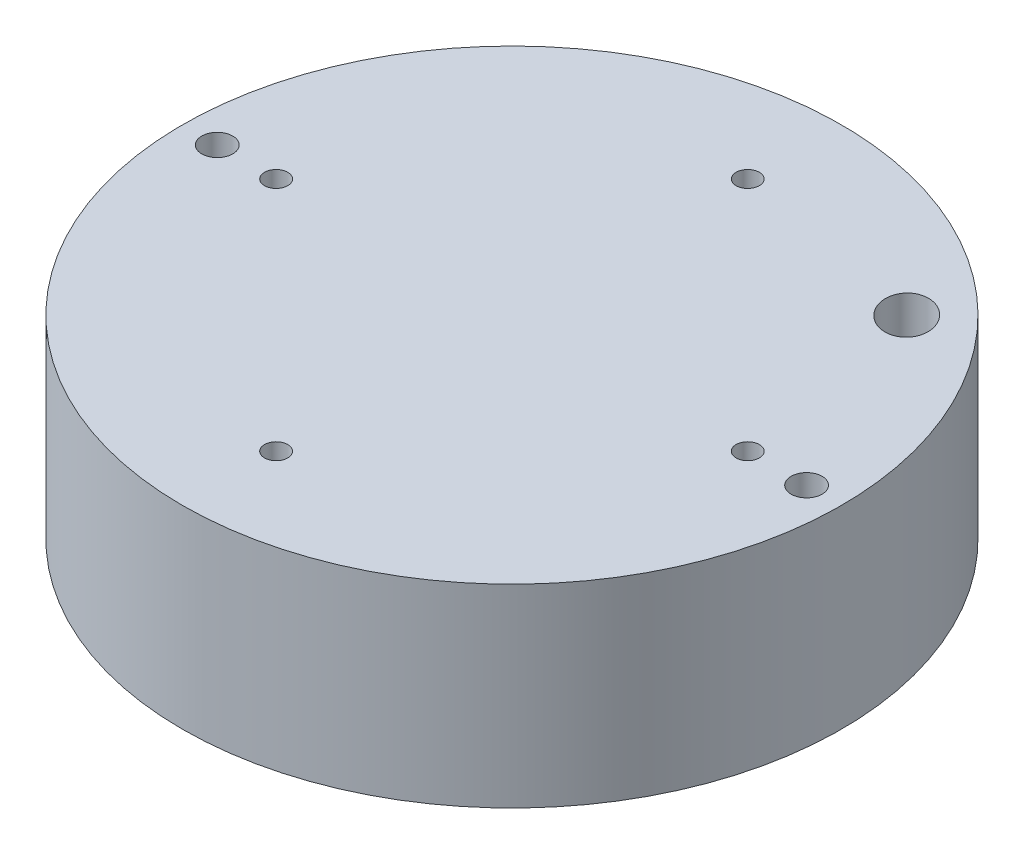
ISO-10303-21;
HEADER;
FILE_DESCRIPTION(('STEP AP214'),'2;1');
FILE_NAME('part.step','',(''),(''),'','','');
FILE_SCHEMA(('AUTOMOTIVE_DESIGN { 1 0 10303 214 1 1 1 1 }'));
ENDSEC;
DATA;
#1=APPLICATION_CONTEXT('core data for automotive mechanical design processes');
#2=APPLICATION_PROTOCOL_DEFINITION('international standard','automotive_design',2000,#1);
#3=PRODUCT_CONTEXT('',#1,'mechanical');
#4=PRODUCT('Part','Part','',(#3));
#5=PRODUCT_RELATED_PRODUCT_CATEGORY('part','',(#4));
#6=PRODUCT_DEFINITION_FORMATION('','',#4);
#7=PRODUCT_DEFINITION_CONTEXT('part definition',#1,'design');
#8=PRODUCT_DEFINITION('design','',#6,#7);
#9=PRODUCT_DEFINITION_SHAPE('','',#8);
#10=(LENGTH_UNIT() NAMED_UNIT(*) SI_UNIT(.MILLI.,.METRE.));
#11=(NAMED_UNIT(*) PLANE_ANGLE_UNIT() SI_UNIT($,.RADIAN.));
#12=(NAMED_UNIT(*) SI_UNIT($,.STERADIAN.) SOLID_ANGLE_UNIT());
#13=UNCERTAINTY_MEASURE_WITH_UNIT(LENGTH_MEASURE(1.E-05),#10,'distance_accuracy_value','');
#14=(GEOMETRIC_REPRESENTATION_CONTEXT(3) GLOBAL_UNCERTAINTY_ASSIGNED_CONTEXT((#13)) GLOBAL_UNIT_ASSIGNED_CONTEXT((#10,
#11,#12)) REPRESENTATION_CONTEXT('',''));
#15=CARTESIAN_POINT('',(0.,0.,0.));
#16=DIRECTION('',(0.,0.,1.));
#17=DIRECTION('',(1.,0.,0.));
#18=AXIS2_PLACEMENT_3D('',#15,#16,#17);
#19=CARTESIAN_POINT('',(0.,25.,0.));
#20=DIRECTION('',(0.,-1.,0.));
#21=DIRECTION('',(0.,0.,-1.));
#22=AXIS2_PLACEMENT_3D('',#19,#20,#21);
#23=CYLINDRICAL_SURFACE('',#22,42.5);
#24=CARTESIAN_POINT('',(0.,25.,0.));
#25=DIRECTION('',(0.,1.,0.));
#26=DIRECTION('',(0.,0.,1.));
#27=AXIS2_PLACEMENT_3D('',#24,#25,#26);
#28=CIRCLE('',#27,42.5);
#29=CARTESIAN_POINT('',(0.,25.,42.5));
#30=VERTEX_POINT('',#29);
#31=EDGE_CURVE('E10',#30,#30,#28,.T.);
#32=ORIENTED_EDGE('',*,*,#31,.F.);
#33=EDGE_LOOP('',(#32));
#34=FACE_BOUND('',#33,.T.);
#35=CARTESIAN_POINT('',(0.,0.,0.));
#36=DIRECTION('',(0.,1.,0.));
#37=DIRECTION('',(0.,0.,1.));
#38=AXIS2_PLACEMENT_3D('',#35,#36,#37);
#39=CIRCLE('',#38,42.5);
#40=CARTESIAN_POINT('',(0.,0.,42.5));
#41=VERTEX_POINT('',#40);
#42=EDGE_CURVE('E46',#41,#41,#39,.T.);
#43=ORIENTED_EDGE('',*,*,#42,.T.);
#44=EDGE_LOOP('',(#43));
#45=FACE_BOUND('',#44,.T.);
#46=ADVANCED_FACE('F43',(#34,#45),#23,.T.);
#47=CARTESIAN_POINT('',(0.,25.,0.));
#48=DIRECTION('',(0.,1.,0.));
#49=DIRECTION('',(0.,0.,1.));
#50=AXIS2_PLACEMENT_3D('',#47,#48,#49);
#51=PLANE('',#50);
#52=CARTESIAN_POINT('',(-38.,25.,0.));
#53=DIRECTION('',(0.,1.,0.));
#54=DIRECTION('',(0.,0.,1.));
#55=AXIS2_PLACEMENT_3D('',#52,#53,#54);
#56=CIRCLE('',#55,2.);
#57=CARTESIAN_POINT('',(-38.,25.,2.00000000000001));
#58=VERTEX_POINT('',#57);
#59=EDGE_CURVE('E71',#58,#58,#56,.T.);
#60=ORIENTED_EDGE('',*,*,#59,.F.);
#61=EDGE_LOOP('',(#60));
#62=FACE_BOUND('',#61,.T.);
#63=CARTESIAN_POINT('',(25.4558441227157,25.,-25.4558441227157));
#64=DIRECTION('',(0.,1.,0.));
#65=DIRECTION('',(0.664438412385067,0.,0.747343024418648));
#66=AXIS2_PLACEMENT_3D('',#63,#64,#65);
#67=ELLIPSE('',#66,3.50000000000001,3.);
#68=CARTESIAN_POINT('',(27.7813785660635,25.,-22.8401435372504));
#69=VERTEX_POINT('',#68);
#70=EDGE_CURVE('E93',#69,#69,#67,.T.);
#71=ORIENTED_EDGE('',*,*,#70,.F.);
#72=EDGE_LOOP('',(#71));
#73=FACE_BOUND('',#72,.T.);
#74=CARTESIAN_POINT('',(-30.405,25.,0.));
#75=DIRECTION('',(0.,1.,0.));
#76=DIRECTION('',(0.,0.,1.));
#77=AXIS2_PLACEMENT_3D('',#74,#75,#76);
#78=CIRCLE('',#77,1.5);
#79=CARTESIAN_POINT('',(-30.405,25.,1.5));
#80=VERTEX_POINT('',#79);
#81=EDGE_CURVE('E84',#80,#80,#78,.T.);
#82=ORIENTED_EDGE('',*,*,#81,.F.);
#83=EDGE_LOOP('',(#82));
#84=FACE_BOUND('',#83,.T.);
#85=CARTESIAN_POINT('',(0.,25.,-30.405));
#86=DIRECTION('',(0.,1.,0.));
#87=DIRECTION('',(0.,0.,1.));
#88=AXIS2_PLACEMENT_3D('',#85,#86,#87);
#89=CIRCLE('',#88,1.5);
#90=CARTESIAN_POINT('',(0.,25.,-28.905));
#91=VERTEX_POINT('',#90);
#92=EDGE_CURVE('E67',#91,#91,#89,.T.);
#93=ORIENTED_EDGE('',*,*,#92,.F.);
#94=EDGE_LOOP('',(#93));
#95=FACE_BOUND('',#94,.T.);
#96=CARTESIAN_POINT('',(38.,25.,0.));
#97=DIRECTION('',(0.,1.,0.));
#98=DIRECTION('',(0.,0.,-1.));
#99=AXIS2_PLACEMENT_3D('',#96,#97,#98);
#100=CIRCLE('',#99,2.);
#101=CARTESIAN_POINT('',(38.,25.,-1.99999999999999));
#102=VERTEX_POINT('',#101);
#103=EDGE_CURVE('E57',#102,#102,#100,.T.);
#104=ORIENTED_EDGE('',*,*,#103,.F.);
#105=EDGE_LOOP('',(#104));
#106=FACE_BOUND('',#105,.T.);
#107=CARTESIAN_POINT('',(30.405,25.,0.));
#108=DIRECTION('',(0.,1.,0.));
#109=DIRECTION('',(0.,0.,1.));
#110=AXIS2_PLACEMENT_3D('',#107,#108,#109);
#111=CIRCLE('',#110,1.5);
#112=CARTESIAN_POINT('',(30.405,25.,1.50000000000001));
#113=VERTEX_POINT('',#112);
#114=EDGE_CURVE('E66',#113,#113,#111,.T.);
#115=ORIENTED_EDGE('',*,*,#114,.F.);
#116=EDGE_LOOP('',(#115));
#117=FACE_BOUND('',#116,.T.);
#118=CARTESIAN_POINT('',(0.,25.,30.405));
#119=DIRECTION('',(0.,1.,0.));
#120=DIRECTION('',(0.,0.,1.));
#121=AXIS2_PLACEMENT_3D('',#118,#119,#120);
#122=CIRCLE('',#121,1.5);
#123=CARTESIAN_POINT('',(0.,25.,31.905));
#124=VERTEX_POINT('',#123);
#125=EDGE_CURVE('E75',#124,#124,#122,.T.);
#126=ORIENTED_EDGE('',*,*,#125,.F.);
#127=EDGE_LOOP('',(#126));
#128=FACE_BOUND('',#127,.T.);
#129=ORIENTED_EDGE('',*,*,#31,.T.);
#130=EDGE_LOOP('',(#129));
#131=FACE_BOUND('',#130,.T.);
#132=ADVANCED_FACE('F121',(#62,#73,#84,#95,#106,#117,#128,#131),#51,.T.);
#133=CARTESIAN_POINT('',(0.,0.,0.));
#134=DIRECTION('',(0.,1.,0.));
#135=DIRECTION('',(0.,0.,1.));
#136=AXIS2_PLACEMENT_3D('',#133,#134,#135);
#137=PLANE('',#136);
#138=CARTESIAN_POINT('',(-38.,0.,0.));
#139=DIRECTION('',(0.,1.,0.));
#140=DIRECTION('',(0.,0.,1.));
#141=AXIS2_PLACEMENT_3D('',#138,#139,#140);
#142=CIRCLE('',#141,2.);
#143=CARTESIAN_POINT('',(-38.,0.,2.00000000000001));
#144=VERTEX_POINT('',#143);
#145=EDGE_CURVE('E55',#144,#144,#142,.F.);
#146=ORIENTED_EDGE('',*,*,#145,.F.);
#147=EDGE_LOOP('',(#146));
#148=FACE_BOUND('',#147,.T.);
#149=CARTESIAN_POINT('',(25.4558441227157,0.,-25.4558441227157));
#150=DIRECTION('',(0.,1.,0.));
#151=DIRECTION('',(0.664438412385067,0.,0.747343024418648));
#152=AXIS2_PLACEMENT_3D('',#149,#150,#151);
#153=ELLIPSE('',#152,3.50000000000001,3.);
#154=CARTESIAN_POINT('',(27.7813785660635,0.,-22.8401435372504));
#155=VERTEX_POINT('',#154);
#156=EDGE_CURVE('E211',#155,#155,#153,.F.);
#157=ORIENTED_EDGE('',*,*,#156,.F.);
#158=EDGE_LOOP('',(#157));
#159=FACE_BOUND('',#158,.T.);
#160=CARTESIAN_POINT('',(-30.405,0.,0.));
#161=DIRECTION('',(0.,1.,0.));
#162=DIRECTION('',(0.,0.,1.));
#163=AXIS2_PLACEMENT_3D('',#160,#161,#162);
#164=CIRCLE('',#163,1.5);
#165=CARTESIAN_POINT('',(-30.405,0.,1.5));
#166=VERTEX_POINT('',#165);
#167=EDGE_CURVE('E205',#166,#166,#164,.F.);
#168=ORIENTED_EDGE('',*,*,#167,.F.);
#169=EDGE_LOOP('',(#168));
#170=FACE_BOUND('',#169,.T.);
#171=CARTESIAN_POINT('',(0.,0.,-30.405));
#172=DIRECTION('',(0.,1.,0.));
#173=DIRECTION('',(0.,0.,1.));
#174=AXIS2_PLACEMENT_3D('',#171,#172,#173);
#175=CIRCLE('',#174,1.5);
#176=CARTESIAN_POINT('',(0.,0.,-28.905));
#177=VERTEX_POINT('',#176);
#178=EDGE_CURVE('E61',#177,#177,#175,.F.);
#179=ORIENTED_EDGE('',*,*,#178,.F.);
#180=EDGE_LOOP('',(#179));
#181=FACE_BOUND('',#180,.T.);
#182=CARTESIAN_POINT('',(38.,0.,0.));
#183=DIRECTION('',(0.,1.,0.));
#184=DIRECTION('',(0.,0.,1.));
#185=AXIS2_PLACEMENT_3D('',#182,#183,#184);
#186=CIRCLE('',#185,2.);
#187=CARTESIAN_POINT('',(38.,0.,2.00000000000001));
#188=VERTEX_POINT('',#187);
#189=EDGE_CURVE('E62',#188,#188,#186,.F.);
#190=ORIENTED_EDGE('',*,*,#189,.F.);
#191=EDGE_LOOP('',(#190));
#192=FACE_BOUND('',#191,.T.);
#193=CARTESIAN_POINT('',(30.405,0.,0.));
#194=DIRECTION('',(0.,1.,0.));
#195=DIRECTION('',(0.,0.,1.));
#196=AXIS2_PLACEMENT_3D('',#193,#194,#195);
#197=CIRCLE('',#196,1.5);
#198=CARTESIAN_POINT('',(30.405,0.,1.50000000000001));
#199=VERTEX_POINT('',#198);
#200=EDGE_CURVE('E79',#199,#199,#197,.F.);
#201=ORIENTED_EDGE('',*,*,#200,.F.);
#202=EDGE_LOOP('',(#201));
#203=FACE_BOUND('',#202,.T.);
#204=CARTESIAN_POINT('',(0.,0.,30.405));
#205=DIRECTION('',(0.,1.,0.));
#206=DIRECTION('',(0.,0.,1.));
#207=AXIS2_PLACEMENT_3D('',#204,#205,#206);
#208=CIRCLE('',#207,1.5);
#209=CARTESIAN_POINT('',(0.,0.,31.905));
#210=VERTEX_POINT('',#209);
#211=EDGE_CURVE('E80',#210,#210,#208,.F.);
#212=ORIENTED_EDGE('',*,*,#211,.F.);
#213=EDGE_LOOP('',(#212));
#214=FACE_BOUND('',#213,.T.);
#215=ORIENTED_EDGE('',*,*,#42,.F.);
#216=EDGE_LOOP('',(#215));
#217=FACE_BOUND('',#216,.T.);
#218=ADVANCED_FACE('F112',(#148,#159,#170,#181,#192,#203,#214,#217),#137,.F.);
#219=CARTESIAN_POINT('',(0.,-9.21954445729289,30.405));
#220=DIRECTION('',(0.,1.,0.));
#221=DIRECTION('',(0.,0.,1.));
#222=AXIS2_PLACEMENT_3D('',#219,#220,#221);
#223=CYLINDRICAL_SURFACE('',#222,1.5);
#224=ORIENTED_EDGE('',*,*,#211,.T.);
#225=EDGE_LOOP('',(#224));
#226=FACE_BOUND('',#225,.T.);
#227=ORIENTED_EDGE('',*,*,#125,.T.);
#228=EDGE_LOOP('',(#227));
#229=FACE_BOUND('',#228,.T.);
#230=ADVANCED_FACE('F108',(#226,#229),#223,.F.);
#231=CARTESIAN_POINT('',(30.405,-9.21954445729289,0.));
#232=DIRECTION('',(0.,1.,0.));
#233=DIRECTION('',(0.,0.,1.));
#234=AXIS2_PLACEMENT_3D('',#231,#232,#233);
#235=CYLINDRICAL_SURFACE('',#234,1.5);
#236=ORIENTED_EDGE('',*,*,#200,.T.);
#237=EDGE_LOOP('',(#236));
#238=FACE_BOUND('',#237,.T.);
#239=ORIENTED_EDGE('',*,*,#114,.T.);
#240=EDGE_LOOP('',(#239));
#241=FACE_BOUND('',#240,.T.);
#242=ADVANCED_FACE('F104',(#238,#241),#235,.F.);
#243=CARTESIAN_POINT('',(38.,-9.21954445729289,0.));
#244=DIRECTION('',(0.,1.,0.));
#245=DIRECTION('',(0.,0.,1.));
#246=AXIS2_PLACEMENT_3D('',#243,#244,#245);
#247=CYLINDRICAL_SURFACE('',#246,2.);
#248=ORIENTED_EDGE('',*,*,#189,.T.);
#249=EDGE_LOOP('',(#248));
#250=FACE_BOUND('',#249,.T.);
#251=ORIENTED_EDGE('',*,*,#103,.T.);
#252=EDGE_LOOP('',(#251));
#253=FACE_BOUND('',#252,.T.);
#254=ADVANCED_FACE('F107',(#250,#253),#247,.F.);
#255=CARTESIAN_POINT('',(0.,-9.21954445729289,-30.405));
#256=DIRECTION('',(0.,1.,0.));
#257=DIRECTION('',(0.,0.,1.));
#258=AXIS2_PLACEMENT_3D('',#255,#256,#257);
#259=CYLINDRICAL_SURFACE('',#258,1.5);
#260=ORIENTED_EDGE('',*,*,#178,.T.);
#261=EDGE_LOOP('',(#260));
#262=FACE_BOUND('',#261,.T.);
#263=ORIENTED_EDGE('',*,*,#92,.T.);
#264=EDGE_LOOP('',(#263));
#265=FACE_BOUND('',#264,.T.);
#266=ADVANCED_FACE('F114',(#262,#265),#259,.F.);
#267=CARTESIAN_POINT('',(-30.405,-9.21954445729289,0.));
#268=DIRECTION('',(0.,1.,0.));
#269=DIRECTION('',(0.,0.,1.));
#270=AXIS2_PLACEMENT_3D('',#267,#268,#269);
#271=CYLINDRICAL_SURFACE('',#270,1.5);
#272=ORIENTED_EDGE('',*,*,#167,.T.);
#273=EDGE_LOOP('',(#272));
#274=FACE_BOUND('',#273,.T.);
#275=ORIENTED_EDGE('',*,*,#81,.T.);
#276=EDGE_LOOP('',(#275));
#277=FACE_BOUND('',#276,.T.);
#278=ADVANCED_FACE('F101',(#274,#277),#271,.F.);
#279=CARTESIAN_POINT('',(25.4558441227157,-9.21954445729289,-25.4558441227157));
#280=DIRECTION('',(0.,1.,0.));
#281=DIRECTION('',(0.664438412385067,0.,0.747343024418648));
#282=AXIS2_PLACEMENT_3D('',#279,#280,#281);
#283=ELLIPSE('',#282,3.50000000000001,3.);
#284=DIRECTION('',(0.,1.,0.));
#285=VECTOR('',#284,1.);
#286=SURFACE_OF_LINEAR_EXTRUSION('',#283,#285);
#287=ORIENTED_EDGE('',*,*,#156,.T.);
#288=EDGE_LOOP('',(#287));
#289=FACE_BOUND('',#288,.T.);
#290=ORIENTED_EDGE('',*,*,#70,.T.);
#291=EDGE_LOOP('',(#290));
#292=FACE_BOUND('',#291,.T.);
#293=ADVANCED_FACE('F96',(#289,#292),#286,.F.);
#294=CARTESIAN_POINT('',(-38.,-9.21954445729289,0.));
#295=DIRECTION('',(0.,1.,0.));
#296=DIRECTION('',(0.,0.,1.));
#297=AXIS2_PLACEMENT_3D('',#294,#295,#296);
#298=CYLINDRICAL_SURFACE('',#297,2.);
#299=ORIENTED_EDGE('',*,*,#145,.T.);
#300=EDGE_LOOP('',(#299));
#301=FACE_BOUND('',#300,.T.);
#302=ORIENTED_EDGE('',*,*,#59,.T.);
#303=EDGE_LOOP('',(#302));
#304=FACE_BOUND('',#303,.T.);
#305=ADVANCED_FACE('F100',(#301,#304),#298,.F.);
#306=CLOSED_SHELL('',(#46,#132,#218,#230,#242,#254,#266,#278,#293,#305));
#307=MANIFOLD_SOLID_BREP('B2',#306);
#308=ADVANCED_BREP_SHAPE_REPRESENTATION('',(#18,#307),#14);
#309=SHAPE_DEFINITION_REPRESENTATION(#9,#308);
ENDSEC;
END-ISO-10303-21;
